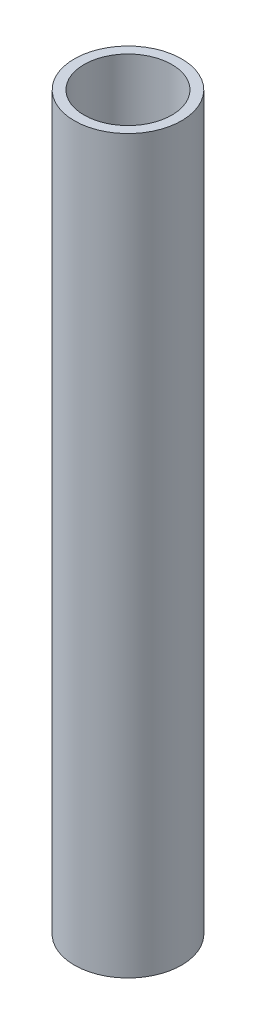
ISO-10303-21;
HEADER;
FILE_DESCRIPTION(('STEP AP214'),'2;1');
FILE_NAME('part.step','',(''),(''),'','','');
FILE_SCHEMA(('AUTOMOTIVE_DESIGN { 1 0 10303 214 1 1 1 1 }'));
ENDSEC;
DATA;
#1=APPLICATION_CONTEXT('core data for automotive mechanical design processes');
#2=APPLICATION_PROTOCOL_DEFINITION('international standard','automotive_design',2000,#1);
#3=PRODUCT_CONTEXT('',#1,'mechanical');
#4=PRODUCT('Part','Part','',(#3));
#5=PRODUCT_RELATED_PRODUCT_CATEGORY('part','',(#4));
#6=PRODUCT_DEFINITION_FORMATION('','',#4);
#7=PRODUCT_DEFINITION_CONTEXT('part definition',#1,'design');
#8=PRODUCT_DEFINITION('design','',#6,#7);
#9=PRODUCT_DEFINITION_SHAPE('','',#8);
#10=(LENGTH_UNIT() NAMED_UNIT(*) SI_UNIT(.MILLI.,.METRE.));
#11=(NAMED_UNIT(*) PLANE_ANGLE_UNIT() SI_UNIT($,.RADIAN.));
#12=(NAMED_UNIT(*) SI_UNIT($,.STERADIAN.) SOLID_ANGLE_UNIT());
#13=UNCERTAINTY_MEASURE_WITH_UNIT(LENGTH_MEASURE(1.E-05),#10,'distance_accuracy_value','');
#14=(GEOMETRIC_REPRESENTATION_CONTEXT(3) GLOBAL_UNCERTAINTY_ASSIGNED_CONTEXT((#13)) GLOBAL_UNIT_ASSIGNED_CONTEXT((#10,
#11,#12)) REPRESENTATION_CONTEXT('',''));
#15=CARTESIAN_POINT('',(0.,0.,0.));
#16=DIRECTION('',(0.,0.,1.));
#17=DIRECTION('',(1.,0.,0.));
#18=AXIS2_PLACEMENT_3D('',#15,#16,#17);
#19=CARTESIAN_POINT('',(0.,150.,0.));
#20=DIRECTION('',(0.,1.,0.));
#21=DIRECTION('',(0.,0.,1.));
#22=AXIS2_PLACEMENT_3D('',#19,#20,#21);
#23=PLANE('',#22);
#24=CARTESIAN_POINT('',(0.,150.,0.));
#25=DIRECTION('',(0.,1.,0.));
#26=DIRECTION('',(0.,0.,1.));
#27=AXIS2_PLACEMENT_3D('',#24,#25,#26);
#28=CIRCLE('',#27,11.);
#29=CARTESIAN_POINT('',(0.,150.,11.));
#30=VERTEX_POINT('',#29);
#31=EDGE_CURVE('E10',#30,#30,#28,.T.);
#32=ORIENTED_EDGE('',*,*,#31,.T.);
#33=EDGE_LOOP('',(#32));
#34=FACE_BOUND('',#33,.T.);
#35=CARTESIAN_POINT('',(0.,150.,0.));
#36=DIRECTION('',(0.,1.,0.));
#37=DIRECTION('',(0.,0.,1.));
#38=AXIS2_PLACEMENT_3D('',#35,#36,#37);
#39=CIRCLE('',#38,9.);
#40=CARTESIAN_POINT('',(0.,150.,9.));
#41=VERTEX_POINT('',#40);
#42=EDGE_CURVE('E42',#41,#41,#39,.T.);
#43=ORIENTED_EDGE('',*,*,#42,.F.);
#44=EDGE_LOOP('',(#43));
#45=FACE_BOUND('',#44,.T.);
#46=ADVANCED_FACE('F31',(#34,#45),#23,.T.);
#47=CARTESIAN_POINT('',(0.,0.,0.));
#48=DIRECTION('',(0.,1.,0.));
#49=DIRECTION('',(0.,0.,1.));
#50=AXIS2_PLACEMENT_3D('',#47,#48,#49);
#51=PLANE('',#50);
#52=CARTESIAN_POINT('',(0.,0.,0.));
#53=DIRECTION('',(0.,1.,0.));
#54=DIRECTION('',(0.,0.,1.));
#55=AXIS2_PLACEMENT_3D('',#52,#53,#54);
#56=CIRCLE('',#55,11.);
#57=CARTESIAN_POINT('',(0.,0.,11.));
#58=VERTEX_POINT('',#57);
#59=EDGE_CURVE('E35',#58,#58,#56,.T.);
#60=ORIENTED_EDGE('',*,*,#59,.F.);
#61=EDGE_LOOP('',(#60));
#62=FACE_BOUND('',#61,.T.);
#63=CARTESIAN_POINT('',(0.,0.,0.));
#64=DIRECTION('',(0.,1.,0.));
#65=DIRECTION('',(0.,0.,1.));
#66=AXIS2_PLACEMENT_3D('',#63,#64,#65);
#67=CIRCLE('',#66,9.);
#68=CARTESIAN_POINT('',(0.,0.,9.));
#69=VERTEX_POINT('',#68);
#70=EDGE_CURVE('E44',#69,#69,#67,.T.);
#71=ORIENTED_EDGE('',*,*,#70,.T.);
#72=EDGE_LOOP('',(#71));
#73=FACE_BOUND('',#72,.T.);
#74=ADVANCED_FACE('F54',(#62,#73),#51,.F.);
#75=CARTESIAN_POINT('',(0.,150.,0.));
#76=DIRECTION('',(0.,-1.,0.));
#77=DIRECTION('',(0.,0.,-1.));
#78=AXIS2_PLACEMENT_3D('',#75,#76,#77);
#79=CYLINDRICAL_SURFACE('',#78,11.);
#80=ORIENTED_EDGE('',*,*,#31,.F.);
#81=EDGE_LOOP('',(#80));
#82=FACE_BOUND('',#81,.T.);
#83=ORIENTED_EDGE('',*,*,#59,.T.);
#84=EDGE_LOOP('',(#83));
#85=FACE_BOUND('',#84,.T.);
#86=ADVANCED_FACE('F33',(#82,#85),#79,.T.);
#87=CARTESIAN_POINT('',(0.,150.,0.));
#88=DIRECTION('',(0.,-1.,0.));
#89=DIRECTION('',(0.,0.,-1.));
#90=AXIS2_PLACEMENT_3D('',#87,#88,#89);
#91=CYLINDRICAL_SURFACE('',#90,9.);
#92=ORIENTED_EDGE('',*,*,#42,.T.);
#93=EDGE_LOOP('',(#92));
#94=FACE_BOUND('',#93,.T.);
#95=ORIENTED_EDGE('',*,*,#70,.F.);
#96=EDGE_LOOP('',(#95));
#97=FACE_BOUND('',#96,.T.);
#98=ADVANCED_FACE('F50',(#94,#97),#91,.F.);
#99=CLOSED_SHELL('',(#46,#74,#86,#98));
#100=MANIFOLD_SOLID_BREP('B2',#99);
#101=ADVANCED_BREP_SHAPE_REPRESENTATION('',(#18,#100),#14);
#102=SHAPE_DEFINITION_REPRESENTATION(#9,#101);
ENDSEC;
END-ISO-10303-21;
